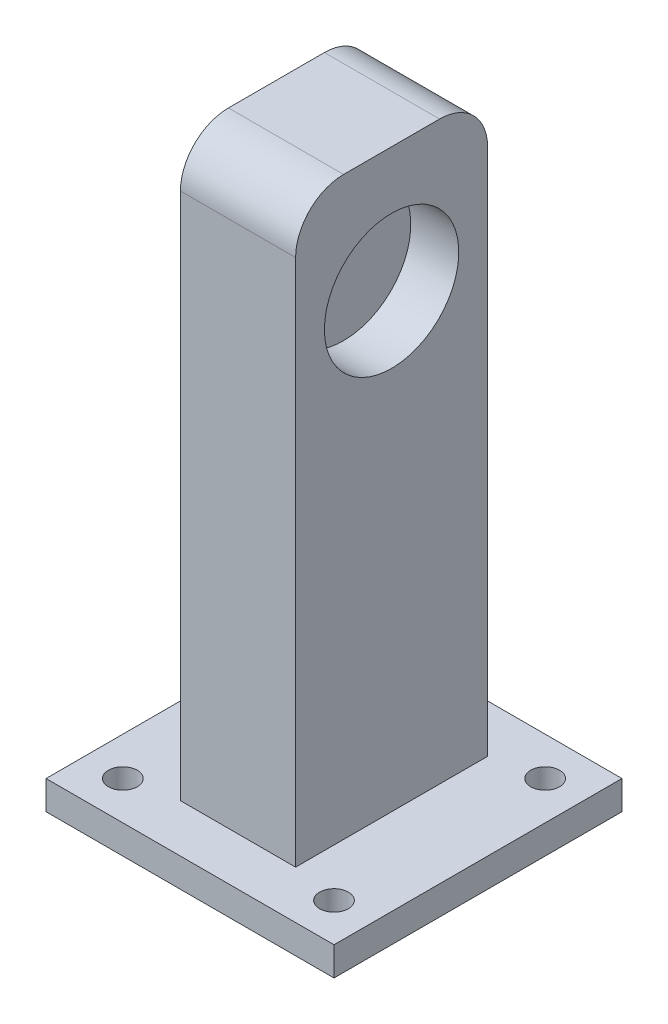
ISO-10303-21;
HEADER;
FILE_DESCRIPTION(('STEP AP214'),'2;1');
FILE_NAME('part.step','',(''),(''),'','','');
FILE_SCHEMA(('AUTOMOTIVE_DESIGN { 1 0 10303 214 1 1 1 1 }'));
ENDSEC;
DATA;
#1=APPLICATION_CONTEXT('core data for automotive mechanical design processes');
#2=APPLICATION_PROTOCOL_DEFINITION('international standard','automotive_design',2000,#1);
#3=PRODUCT_CONTEXT('',#1,'mechanical');
#4=PRODUCT('Part','Part','',(#3));
#5=PRODUCT_RELATED_PRODUCT_CATEGORY('part','',(#4));
#6=PRODUCT_DEFINITION_FORMATION('','',#4);
#7=PRODUCT_DEFINITION_CONTEXT('part definition',#1,'design');
#8=PRODUCT_DEFINITION('design','',#6,#7);
#9=PRODUCT_DEFINITION_SHAPE('','',#8);
#10=(LENGTH_UNIT() NAMED_UNIT(*) SI_UNIT(.MILLI.,.METRE.));
#11=(NAMED_UNIT(*) PLANE_ANGLE_UNIT() SI_UNIT($,.RADIAN.));
#12=(NAMED_UNIT(*) SI_UNIT($,.STERADIAN.) SOLID_ANGLE_UNIT());
#13=UNCERTAINTY_MEASURE_WITH_UNIT(LENGTH_MEASURE(1.E-05),#10,'distance_accuracy_value','');
#14=(GEOMETRIC_REPRESENTATION_CONTEXT(3) GLOBAL_UNCERTAINTY_ASSIGNED_CONTEXT((#13)) GLOBAL_UNIT_ASSIGNED_CONTEXT((#10,
#11,#12)) REPRESENTATION_CONTEXT('',''));
#15=CARTESIAN_POINT('',(0.,0.,0.));
#16=DIRECTION('',(0.,0.,1.));
#17=DIRECTION('',(1.,0.,0.));
#18=AXIS2_PLACEMENT_3D('',#15,#16,#17);
#19=CARTESIAN_POINT('',(30.,3.,30.));
#20=DIRECTION('',(0.,-1.,0.));
#21=DIRECTION('',(0.,0.,-1.));
#22=AXIS2_PLACEMENT_3D('',#19,#20,#21);
#23=PLANE('',#22);
#24=CARTESIAN_POINT('',(4.,3.,26.));
#25=DIRECTION('',(0.,1.,0.));
#26=DIRECTION('',(-1.,0.,0.));
#27=AXIS2_PLACEMENT_3D('',#24,#25,#26);
#28=CIRCLE('',#27,1.5);
#29=CARTESIAN_POINT('',(2.5,3.,26.));
#30=VERTEX_POINT('',#29);
#31=EDGE_CURVE('E228',#30,#30,#28,.T.);
#32=ORIENTED_EDGE('',*,*,#31,.F.);
#33=EDGE_LOOP('',(#32));
#34=FACE_BOUND('',#33,.T.);
#35=CARTESIAN_POINT('',(26.,2.99999999999999,26.));
#36=DIRECTION('',(0.,1.,0.));
#37=DIRECTION('',(-1.,0.,0.));
#38=AXIS2_PLACEMENT_3D('',#35,#36,#37);
#39=CIRCLE('',#38,1.5);
#40=CARTESIAN_POINT('',(24.5,2.99999999999999,26.));
#41=VERTEX_POINT('',#40);
#42=EDGE_CURVE('E234',#41,#41,#39,.T.);
#43=ORIENTED_EDGE('',*,*,#42,.F.);
#44=EDGE_LOOP('',(#43));
#45=FACE_BOUND('',#44,.T.);
#46=CARTESIAN_POINT('',(26.,2.99999999999999,4.));
#47=DIRECTION('',(0.,1.,0.));
#48=DIRECTION('',(-1.,0.,0.));
#49=AXIS2_PLACEMENT_3D('',#46,#47,#48);
#50=CIRCLE('',#49,1.5);
#51=CARTESIAN_POINT('',(24.5,2.99999999999999,4.));
#52=VERTEX_POINT('',#51);
#53=EDGE_CURVE('E222',#52,#52,#50,.T.);
#54=ORIENTED_EDGE('',*,*,#53,.F.);
#55=EDGE_LOOP('',(#54));
#56=FACE_BOUND('',#55,.T.);
#57=CARTESIAN_POINT('',(4.,3.,4.));
#58=DIRECTION('',(0.,1.,0.));
#59=DIRECTION('',(-1.,0.,0.));
#60=AXIS2_PLACEMENT_3D('',#57,#58,#59);
#61=CIRCLE('',#60,1.5);
#62=CARTESIAN_POINT('',(2.5,3.,4.));
#63=VERTEX_POINT('',#62);
#64=EDGE_CURVE('E219',#63,#63,#61,.T.);
#65=ORIENTED_EDGE('',*,*,#64,.F.);
#66=EDGE_LOOP('',(#65));
#67=FACE_BOUND('',#66,.T.);
#68=DIRECTION('',(-1.,0.,0.));
#69=VECTOR('',#68,1.);
#70=CARTESIAN_POINT('',(30.,3.,0.));
#71=LINE('',#70,#69);
#72=CARTESIAN_POINT('',(30.,3.,0.));
#73=VERTEX_POINT('',#72);
#74=CARTESIAN_POINT('',(0.,3.,0.));
#75=VERTEX_POINT('',#74);
#76=EDGE_CURVE('E146',#73,#75,#71,.T.);
#77=ORIENTED_EDGE('',*,*,#76,.T.);
#78=DIRECTION('',(0.,0.,-1.));
#79=VECTOR('',#78,1.);
#80=CARTESIAN_POINT('',(0.,3.,30.));
#81=LINE('',#80,#79);
#82=CARTESIAN_POINT('',(0.,3.,30.));
#83=VERTEX_POINT('',#82);
#84=EDGE_CURVE('E152',#83,#75,#81,.T.);
#85=ORIENTED_EDGE('',*,*,#84,.F.);
#86=DIRECTION('',(-1.,0.,0.));
#87=VECTOR('',#86,1.);
#88=CARTESIAN_POINT('',(30.,3.,30.));
#89=LINE('',#88,#87);
#90=CARTESIAN_POINT('',(30.,3.,30.));
#91=VERTEX_POINT('',#90);
#92=EDGE_CURVE('E150',#91,#83,#89,.T.);
#93=ORIENTED_EDGE('',*,*,#92,.F.);
#94=DIRECTION('',(0.,0.,-1.));
#95=VECTOR('',#94,1.);
#96=CARTESIAN_POINT('',(30.,3.,30.));
#97=LINE('',#96,#95);
#98=EDGE_CURVE('E162',#91,#73,#97,.T.);
#99=ORIENTED_EDGE('',*,*,#98,.T.);
#100=EDGE_LOOP('',(#77,#85,#93,#99));
#101=FACE_BOUND('',#100,.T.);
#102=DIRECTION('',(0.,0.,1.));
#103=VECTOR('',#102,1.);
#104=CARTESIAN_POINT('',(9.,3.,5.00000000000001));
#105=LINE('',#104,#103);
#106=CARTESIAN_POINT('',(9.,3.,5.00000000000001));
#107=VERTEX_POINT('',#106);
#108=CARTESIAN_POINT('',(9.,3.00000000000001,25.));
#109=VERTEX_POINT('',#108);
#110=EDGE_CURVE('E133',#107,#109,#105,.T.);
#111=ORIENTED_EDGE('',*,*,#110,.F.);
#112=DIRECTION('',(-1.,0.,0.));
#113=VECTOR('',#112,1.);
#114=CARTESIAN_POINT('',(21.,3.,5.00000000000001));
#115=LINE('',#114,#113);
#116=CARTESIAN_POINT('',(21.,3.,5.00000000000001));
#117=VERTEX_POINT('',#116);
#118=EDGE_CURVE('E120',#117,#107,#115,.T.);
#119=ORIENTED_EDGE('',*,*,#118,.F.);
#120=DIRECTION('',(0.,0.,1.));
#121=VECTOR('',#120,1.);
#122=CARTESIAN_POINT('',(21.,3.,5.00000000000001));
#123=LINE('',#122,#121);
#124=CARTESIAN_POINT('',(21.,3.00000000000001,25.));
#125=VERTEX_POINT('',#124);
#126=EDGE_CURVE('E122',#117,#125,#123,.T.);
#127=ORIENTED_EDGE('',*,*,#126,.T.);
#128=DIRECTION('',(-1.,0.,0.));
#129=VECTOR('',#128,1.);
#130=CARTESIAN_POINT('',(21.,3.00000000000001,25.));
#131=LINE('',#130,#129);
#132=EDGE_CURVE('E134',#125,#109,#131,.T.);
#133=ORIENTED_EDGE('',*,*,#132,.T.);
#134=EDGE_LOOP('',(#111,#119,#127,#133));
#135=FACE_BOUND('',#134,.T.);
#136=ADVANCED_FACE('F41',(#34,#45,#56,#67,#101,#135),#23,.F.);
#137=CARTESIAN_POINT('',(0.,3.,30.));
#138=DIRECTION('',(1.,0.,0.));
#139=DIRECTION('',(0.,0.,-1.));
#140=AXIS2_PLACEMENT_3D('',#137,#138,#139);
#141=PLANE('',#140);
#142=DIRECTION('',(0.,-1.,0.));
#143=VECTOR('',#142,1.);
#144=CARTESIAN_POINT('',(0.,3.,0.));
#145=LINE('',#144,#143);
#146=CARTESIAN_POINT('',(0.,0.,0.));
#147=VERTEX_POINT('',#146);
#148=EDGE_CURVE('E137',#75,#147,#145,.T.);
#149=ORIENTED_EDGE('',*,*,#148,.T.);
#150=DIRECTION('',(0.,0.,-1.));
#151=VECTOR('',#150,1.);
#152=CARTESIAN_POINT('',(0.,0.,30.));
#153=LINE('',#152,#151);
#154=CARTESIAN_POINT('',(0.,0.,30.));
#155=VERTEX_POINT('',#154);
#156=EDGE_CURVE('E168',#155,#147,#153,.T.);
#157=ORIENTED_EDGE('',*,*,#156,.F.);
#158=DIRECTION('',(0.,-1.,0.));
#159=VECTOR('',#158,1.);
#160=CARTESIAN_POINT('',(0.,3.,30.));
#161=LINE('',#160,#159);
#162=EDGE_CURVE('E142',#83,#155,#161,.T.);
#163=ORIENTED_EDGE('',*,*,#162,.F.);
#164=ORIENTED_EDGE('',*,*,#84,.T.);
#165=EDGE_LOOP('',(#149,#157,#163,#164));
#166=FACE_BOUND('',#165,.T.);
#167=ADVANCED_FACE('F247',(#166),#141,.F.);
#168=CARTESIAN_POINT('',(0.,0.,30.));
#169=DIRECTION('',(0.,1.,0.));
#170=DIRECTION('',(0.,0.,1.));
#171=AXIS2_PLACEMENT_3D('',#168,#169,#170);
#172=PLANE('',#171);
#173=CARTESIAN_POINT('',(4.,0.,26.));
#174=DIRECTION('',(0.,1.,0.));
#175=DIRECTION('',(-1.,0.,0.));
#176=AXIS2_PLACEMENT_3D('',#173,#174,#175);
#177=CIRCLE('',#176,1.5);
#178=CARTESIAN_POINT('',(2.5,0.,26.));
#179=VERTEX_POINT('',#178);
#180=EDGE_CURVE('E225',#179,#179,#177,.T.);
#181=ORIENTED_EDGE('',*,*,#180,.T.);
#182=EDGE_LOOP('',(#181));
#183=FACE_BOUND('',#182,.T.);
#184=CARTESIAN_POINT('',(26.,0.,26.));
#185=DIRECTION('',(0.,1.,0.));
#186=DIRECTION('',(-1.,0.,0.));
#187=AXIS2_PLACEMENT_3D('',#184,#185,#186);
#188=CIRCLE('',#187,1.5);
#189=CARTESIAN_POINT('',(24.5,0.,26.));
#190=VERTEX_POINT('',#189);
#191=EDGE_CURVE('E231',#190,#190,#188,.T.);
#192=ORIENTED_EDGE('',*,*,#191,.T.);
#193=EDGE_LOOP('',(#192));
#194=FACE_BOUND('',#193,.T.);
#195=CARTESIAN_POINT('',(26.,0.,4.));
#196=DIRECTION('',(0.,1.,0.));
#197=DIRECTION('',(-1.,0.,0.));
#198=AXIS2_PLACEMENT_3D('',#195,#196,#197);
#199=CIRCLE('',#198,1.5);
#200=CARTESIAN_POINT('',(24.5,0.,4.));
#201=VERTEX_POINT('',#200);
#202=EDGE_CURVE('E237',#201,#201,#199,.T.);
#203=ORIENTED_EDGE('',*,*,#202,.T.);
#204=EDGE_LOOP('',(#203));
#205=FACE_BOUND('',#204,.T.);
#206=CARTESIAN_POINT('',(4.,0.,4.));
#207=DIRECTION('',(0.,1.,0.));
#208=DIRECTION('',(-1.,0.,0.));
#209=AXIS2_PLACEMENT_3D('',#206,#207,#208);
#210=CIRCLE('',#209,1.5);
#211=CARTESIAN_POINT('',(2.5,0.,4.));
#212=VERTEX_POINT('',#211);
#213=EDGE_CURVE('E216',#212,#212,#210,.T.);
#214=ORIENTED_EDGE('',*,*,#213,.T.);
#215=EDGE_LOOP('',(#214));
#216=FACE_BOUND('',#215,.T.);
#217=DIRECTION('',(1.,0.,0.));
#218=VECTOR('',#217,1.);
#219=CARTESIAN_POINT('',(0.,0.,0.));
#220=LINE('',#219,#218);
#221=CARTESIAN_POINT('',(30.,0.,0.));
#222=VERTEX_POINT('',#221);
#223=EDGE_CURVE('E155',#147,#222,#220,.T.);
#224=ORIENTED_EDGE('',*,*,#223,.T.);
#225=DIRECTION('',(0.,0.,-1.));
#226=VECTOR('',#225,1.);
#227=CARTESIAN_POINT('',(30.,0.,30.));
#228=LINE('',#227,#226);
#229=CARTESIAN_POINT('',(30.,0.,30.));
#230=VERTEX_POINT('',#229);
#231=EDGE_CURVE('E165',#230,#222,#228,.T.);
#232=ORIENTED_EDGE('',*,*,#231,.F.);
#233=DIRECTION('',(1.,0.,0.));
#234=VECTOR('',#233,1.);
#235=CARTESIAN_POINT('',(0.,0.,30.));
#236=LINE('',#235,#234);
#237=EDGE_CURVE('E145',#155,#230,#236,.T.);
#238=ORIENTED_EDGE('',*,*,#237,.F.);
#239=ORIENTED_EDGE('',*,*,#156,.T.);
#240=EDGE_LOOP('',(#224,#232,#238,#239));
#241=FACE_BOUND('',#240,.T.);
#242=ADVANCED_FACE('F265',(#183,#194,#205,#216,#241),#172,.F.);
#243=CARTESIAN_POINT('',(30.,0.,30.));
#244=DIRECTION('',(-1.,0.,0.));
#245=DIRECTION('',(0.,0.,1.));
#246=AXIS2_PLACEMENT_3D('',#243,#244,#245);
#247=PLANE('',#246);
#248=DIRECTION('',(0.,1.,0.));
#249=VECTOR('',#248,1.);
#250=CARTESIAN_POINT('',(30.,0.,0.));
#251=LINE('',#250,#249);
#252=EDGE_CURVE('E157',#222,#73,#251,.T.);
#253=ORIENTED_EDGE('',*,*,#252,.T.);
#254=ORIENTED_EDGE('',*,*,#98,.F.);
#255=DIRECTION('',(0.,1.,0.));
#256=VECTOR('',#255,1.);
#257=CARTESIAN_POINT('',(30.,0.,30.));
#258=LINE('',#257,#256);
#259=EDGE_CURVE('E148',#230,#91,#258,.T.);
#260=ORIENTED_EDGE('',*,*,#259,.F.);
#261=ORIENTED_EDGE('',*,*,#231,.T.);
#262=EDGE_LOOP('',(#253,#254,#260,#261));
#263=FACE_BOUND('',#262,.T.);
#264=ADVANCED_FACE('F270',(#263),#247,.F.);
#265=CARTESIAN_POINT('',(0.,0.,30.));
#266=DIRECTION('',(0.,0.,1.));
#267=DIRECTION('',(1.,0.,0.));
#268=AXIS2_PLACEMENT_3D('',#265,#266,#267);
#269=PLANE('',#268);
#270=ORIENTED_EDGE('',*,*,#162,.T.);
#271=ORIENTED_EDGE('',*,*,#237,.T.);
#272=ORIENTED_EDGE('',*,*,#259,.T.);
#273=ORIENTED_EDGE('',*,*,#92,.T.);
#274=EDGE_LOOP('',(#270,#271,#272,#273));
#275=FACE_BOUND('',#274,.T.);
#276=ADVANCED_FACE('F268',(#275),#269,.T.);
#277=CARTESIAN_POINT('',(0.,0.,0.));
#278=DIRECTION('',(0.,0.,1.));
#279=DIRECTION('',(1.,0.,0.));
#280=AXIS2_PLACEMENT_3D('',#277,#278,#279);
#281=PLANE('',#280);
#282=ORIENTED_EDGE('',*,*,#148,.F.);
#283=ORIENTED_EDGE('',*,*,#76,.F.);
#284=ORIENTED_EDGE('',*,*,#252,.F.);
#285=ORIENTED_EDGE('',*,*,#223,.F.);
#286=EDGE_LOOP('',(#282,#283,#284,#285));
#287=FACE_BOUND('',#286,.T.);
#288=ADVANCED_FACE('F262',(#287),#281,.F.);
#289=CARTESIAN_POINT('',(21.,63.,5.));
#290=DIRECTION('',(0.,0.,-1.));
#291=DIRECTION('',(0.,1.,0.));
#292=AXIS2_PLACEMENT_3D('',#289,#290,#291);
#293=PLANE('',#292);
#294=DIRECTION('',(0.,-1.,0.));
#295=VECTOR('',#294,1.);
#296=CARTESIAN_POINT('',(9.,63.,5.));
#297=LINE('',#296,#295);
#298=CARTESIAN_POINT('',(9.,58.,5.));
#299=VERTEX_POINT('',#298);
#300=EDGE_CURVE('E204',#299,#107,#297,.T.);
#301=ORIENTED_EDGE('',*,*,#300,.F.);
#302=DIRECTION('',(-1.,0.,0.));
#303=VECTOR('',#302,1.);
#304=CARTESIAN_POINT('',(21.,58.,5.));
#305=LINE('',#304,#303);
#306=CARTESIAN_POINT('',(21.,58.,5.));
#307=VERTEX_POINT('',#306);
#308=EDGE_CURVE('E11',#299,#307,#305,.F.);
#309=ORIENTED_EDGE('',*,*,#308,.T.);
#310=DIRECTION('',(0.,-1.,0.));
#311=VECTOR('',#310,1.);
#312=CARTESIAN_POINT('',(21.,63.,5.));
#313=LINE('',#312,#311);
#314=EDGE_CURVE('E116',#307,#117,#313,.T.);
#315=ORIENTED_EDGE('',*,*,#314,.T.);
#316=ORIENTED_EDGE('',*,*,#118,.T.);
#317=EDGE_LOOP('',(#301,#309,#315,#316));
#318=FACE_BOUND('',#317,.T.);
#319=ADVANCED_FACE('F118',(#318),#293,.T.);
#320=CARTESIAN_POINT('',(21.,63.,25.));
#321=DIRECTION('',(0.,1.,0.));
#322=DIRECTION('',(0.,0.,1.));
#323=AXIS2_PLACEMENT_3D('',#320,#321,#322);
#324=PLANE('',#323);
#325=DIRECTION('',(0.,0.,-1.));
#326=VECTOR('',#325,1.);
#327=CARTESIAN_POINT('',(9.,63.,25.));
#328=LINE('',#327,#326);
#329=CARTESIAN_POINT('',(9.,63.,20.));
#330=VERTEX_POINT('',#329);
#331=CARTESIAN_POINT('',(9.,63.,10.));
#332=VERTEX_POINT('',#331);
#333=EDGE_CURVE('E123',#330,#332,#328,.T.);
#334=ORIENTED_EDGE('',*,*,#333,.F.);
#335=DIRECTION('',(-1.,0.,0.));
#336=VECTOR('',#335,1.);
#337=CARTESIAN_POINT('',(21.,63.,20.));
#338=LINE('',#337,#336);
#339=CARTESIAN_POINT('',(21.,63.,20.));
#340=VERTEX_POINT('',#339);
#341=EDGE_CURVE('E181',#330,#340,#338,.F.);
#342=ORIENTED_EDGE('',*,*,#341,.T.);
#343=DIRECTION('',(0.,0.,-1.));
#344=VECTOR('',#343,1.);
#345=CARTESIAN_POINT('',(21.,63.,25.));
#346=LINE('',#345,#344);
#347=CARTESIAN_POINT('',(21.,63.,10.));
#348=VERTEX_POINT('',#347);
#349=EDGE_CURVE('E135',#340,#348,#346,.T.);
#350=ORIENTED_EDGE('',*,*,#349,.T.);
#351=DIRECTION('',(-1.,0.,0.));
#352=VECTOR('',#351,1.);
#353=CARTESIAN_POINT('',(21.,63.,10.));
#354=LINE('',#353,#352);
#355=EDGE_CURVE('E178',#348,#332,#354,.T.);
#356=ORIENTED_EDGE('',*,*,#355,.T.);
#357=EDGE_LOOP('',(#334,#342,#350,#356));
#358=FACE_BOUND('',#357,.T.);
#359=ADVANCED_FACE('F199',(#358),#324,.T.);
#360=CARTESIAN_POINT('',(21.,3.00000000000001,25.));
#361=DIRECTION('',(0.,0.,1.));
#362=DIRECTION('',(1.,0.,0.));
#363=AXIS2_PLACEMENT_3D('',#360,#361,#362);
#364=PLANE('',#363);
#365=DIRECTION('',(0.,1.,0.));
#366=VECTOR('',#365,1.);
#367=CARTESIAN_POINT('',(21.,3.00000000000001,25.));
#368=LINE('',#367,#366);
#369=CARTESIAN_POINT('',(21.,58.,25.));
#370=VERTEX_POINT('',#369);
#371=EDGE_CURVE('E129',#125,#370,#368,.T.);
#372=ORIENTED_EDGE('',*,*,#371,.T.);
#373=DIRECTION('',(-1.,0.,0.));
#374=VECTOR('',#373,1.);
#375=CARTESIAN_POINT('',(21.,58.,25.));
#376=LINE('',#375,#374);
#377=CARTESIAN_POINT('',(9.,58.,25.));
#378=VERTEX_POINT('',#377);
#379=EDGE_CURVE('E171',#370,#378,#376,.T.);
#380=ORIENTED_EDGE('',*,*,#379,.T.);
#381=DIRECTION('',(0.,1.,0.));
#382=VECTOR('',#381,1.);
#383=CARTESIAN_POINT('',(9.,3.00000000000001,25.));
#384=LINE('',#383,#382);
#385=EDGE_CURVE('E197',#109,#378,#384,.T.);
#386=ORIENTED_EDGE('',*,*,#385,.F.);
#387=ORIENTED_EDGE('',*,*,#132,.F.);
#388=EDGE_LOOP('',(#372,#380,#386,#387));
#389=FACE_BOUND('',#388,.T.);
#390=ADVANCED_FACE('F188',(#389),#364,.T.);
#391=CARTESIAN_POINT('',(21.,0.,0.));
#392=DIRECTION('',(-1.,0.,0.));
#393=DIRECTION('',(0.,0.,1.));
#394=AXIS2_PLACEMENT_3D('',#391,#392,#393);
#395=PLANE('',#394);
#396=CARTESIAN_POINT('',(21.,50.,15.));
#397=DIRECTION('',(-1.,0.,0.));
#398=DIRECTION('',(0.,0.,1.));
#399=AXIS2_PLACEMENT_3D('',#396,#397,#398);
#400=CIRCLE('',#399,7.);
#401=CARTESIAN_POINT('',(21.,50.,22.));
#402=VERTEX_POINT('',#401);
#403=EDGE_CURVE('E210',#402,#402,#400,.T.);
#404=ORIENTED_EDGE('',*,*,#403,.T.);
#405=EDGE_LOOP('',(#404));
#406=FACE_BOUND('',#405,.T.);
#407=ORIENTED_EDGE('',*,*,#349,.F.);
#408=CARTESIAN_POINT('',(21.,58.,20.));
#409=DIRECTION('',(-1.,0.,0.));
#410=DIRECTION('',(0.,0.,1.));
#411=AXIS2_PLACEMENT_3D('',#408,#409,#410);
#412=CIRCLE('',#411,5.);
#413=EDGE_CURVE('E49',#340,#370,#412,.F.);
#414=ORIENTED_EDGE('',*,*,#413,.T.);
#415=ORIENTED_EDGE('',*,*,#371,.F.);
#416=ORIENTED_EDGE('',*,*,#126,.F.);
#417=ORIENTED_EDGE('',*,*,#314,.F.);
#418=CARTESIAN_POINT('',(21.,58.,10.));
#419=DIRECTION('',(-1.,0.,0.));
#420=DIRECTION('',(0.,0.,1.));
#421=AXIS2_PLACEMENT_3D('',#418,#419,#420);
#422=CIRCLE('',#421,5.);
#423=EDGE_CURVE('E61',#307,#348,#422,.F.);
#424=ORIENTED_EDGE('',*,*,#423,.T.);
#425=EDGE_LOOP('',(#407,#414,#415,#416,#417,#424));
#426=FACE_BOUND('',#425,.T.);
#427=ADVANCED_FACE('F127',(#406,#426),#395,.F.);
#428=CARTESIAN_POINT('',(9.,0.,0.));
#429=DIRECTION('',(-1.,0.,0.));
#430=DIRECTION('',(0.,0.,1.));
#431=AXIS2_PLACEMENT_3D('',#428,#429,#430);
#432=PLANE('',#431);
#433=CARTESIAN_POINT('',(9.,50.,15.));
#434=DIRECTION('',(-1.,0.,0.));
#435=DIRECTION('',(0.,0.,1.));
#436=AXIS2_PLACEMENT_3D('',#433,#434,#435);
#437=CIRCLE('',#436,7.);
#438=CARTESIAN_POINT('',(9.,50.,22.));
#439=VERTEX_POINT('',#438);
#440=EDGE_CURVE('E207',#439,#439,#437,.T.);
#441=ORIENTED_EDGE('',*,*,#440,.F.);
#442=EDGE_LOOP('',(#441));
#443=FACE_BOUND('',#442,.T.);
#444=ORIENTED_EDGE('',*,*,#385,.T.);
#445=CARTESIAN_POINT('',(9.,58.,20.));
#446=DIRECTION('',(-1.,0.,0.));
#447=DIRECTION('',(0.,0.,1.));
#448=AXIS2_PLACEMENT_3D('',#445,#446,#447);
#449=CIRCLE('',#448,5.);
#450=EDGE_CURVE('E176',#378,#330,#449,.T.);
#451=ORIENTED_EDGE('',*,*,#450,.T.);
#452=ORIENTED_EDGE('',*,*,#333,.T.);
#453=CARTESIAN_POINT('',(9.,58.,10.));
#454=DIRECTION('',(-1.,0.,0.));
#455=DIRECTION('',(0.,0.,1.));
#456=AXIS2_PLACEMENT_3D('',#453,#454,#455);
#457=CIRCLE('',#456,5.);
#458=EDGE_CURVE('E174',#332,#299,#457,.T.);
#459=ORIENTED_EDGE('',*,*,#458,.T.);
#460=ORIENTED_EDGE('',*,*,#300,.T.);
#461=ORIENTED_EDGE('',*,*,#110,.T.);
#462=EDGE_LOOP('',(#444,#451,#452,#459,#460,#461));
#463=FACE_BOUND('',#462,.T.);
#464=ADVANCED_FACE('F196',(#443,#463),#432,.T.);
#465=CARTESIAN_POINT('',(14.,50.,15.));
#466=DIRECTION('',(-1.,0.,0.));
#467=DIRECTION('',(0.,0.,1.));
#468=AXIS2_PLACEMENT_3D('',#465,#466,#467);
#469=CYLINDRICAL_SURFACE('',#468,7.);
#470=CARTESIAN_POINT('',(14.,50.,15.));
#471=DIRECTION('',(-1.,0.,0.));
#472=DIRECTION('',(0.,0.,1.));
#473=AXIS2_PLACEMENT_3D('',#470,#471,#472);
#474=CIRCLE('',#473,7.);
#475=CARTESIAN_POINT('',(14.,50.,22.));
#476=VERTEX_POINT('',#475);
#477=EDGE_CURVE('E205',#476,#476,#474,.T.);
#478=ORIENTED_EDGE('',*,*,#477,.F.);
#479=EDGE_LOOP('',(#478));
#480=FACE_BOUND('',#479,.T.);
#481=ORIENTED_EDGE('',*,*,#440,.T.);
#482=EDGE_LOOP('',(#481));
#483=FACE_BOUND('',#482,.T.);
#484=ADVANCED_FACE('F317',(#480,#483),#469,.F.);
#485=CARTESIAN_POINT('',(14.,50.,15.));
#486=DIRECTION('',(-1.,0.,0.));
#487=DIRECTION('',(0.,0.,1.));
#488=AXIS2_PLACEMENT_3D('',#485,#486,#487);
#489=PLANE('',#488);
#490=ORIENTED_EDGE('',*,*,#477,.T.);
#491=EDGE_LOOP('',(#490));
#492=FACE_BOUND('',#491,.T.);
#493=ADVANCED_FACE('F313',(#492),#489,.T.);
#494=CARTESIAN_POINT('',(21.,50.,15.));
#495=DIRECTION('',(-1.,0.,0.));
#496=DIRECTION('',(0.,0.,1.));
#497=AXIS2_PLACEMENT_3D('',#494,#495,#496);
#498=CYLINDRICAL_SURFACE('',#497,7.);
#499=ORIENTED_EDGE('',*,*,#403,.F.);
#500=EDGE_LOOP('',(#499));
#501=FACE_BOUND('',#500,.T.);
#502=CARTESIAN_POINT('',(16.,50.,15.));
#503=DIRECTION('',(-1.,0.,0.));
#504=DIRECTION('',(0.,0.,1.));
#505=AXIS2_PLACEMENT_3D('',#502,#503,#504);
#506=CIRCLE('',#505,7.);
#507=CARTESIAN_POINT('',(16.,50.,22.));
#508=VERTEX_POINT('',#507);
#509=EDGE_CURVE('E213',#508,#508,#506,.T.);
#510=ORIENTED_EDGE('',*,*,#509,.T.);
#511=EDGE_LOOP('',(#510));
#512=FACE_BOUND('',#511,.T.);
#513=ADVANCED_FACE('F309',(#501,#512),#498,.F.);
#514=CARTESIAN_POINT('',(16.,50.,15.));
#515=DIRECTION('',(-1.,0.,0.));
#516=DIRECTION('',(0.,0.,1.));
#517=AXIS2_PLACEMENT_3D('',#514,#515,#516);
#518=PLANE('',#517);
#519=ORIENTED_EDGE('',*,*,#509,.F.);
#520=EDGE_LOOP('',(#519));
#521=FACE_BOUND('',#520,.T.);
#522=ADVANCED_FACE('F305',(#521),#518,.F.);
#523=CARTESIAN_POINT('',(4.,0.,4.));
#524=DIRECTION('',(0.,1.,0.));
#525=DIRECTION('',(-1.,0.,0.));
#526=AXIS2_PLACEMENT_3D('',#523,#524,#525);
#527=CYLINDRICAL_SURFACE('',#526,1.5);
#528=CARTESIAN_POINT('',(2.5,0.,4.));
#529=CARTESIAN_POINT('',(2.5,0.0312499999999993,4.));
#530=CARTESIAN_POINT('',(2.5,0.0624999999999993,4.));
#531=CARTESIAN_POINT('',(2.5,0.124999999999999,4.));
#532=CARTESIAN_POINT('',(2.5,0.156249999999999,4.));
#533=CARTESIAN_POINT('',(2.5,0.21875,4.));
#534=CARTESIAN_POINT('',(2.5,0.25,4.));
#535=CARTESIAN_POINT('',(2.5,0.3125,4.));
#536=CARTESIAN_POINT('',(2.5,0.34375,4.));
#537=CARTESIAN_POINT('',(2.5,0.40625,4.));
#538=CARTESIAN_POINT('',(2.5,0.4375,4.));
#539=CARTESIAN_POINT('',(2.5,0.5,4.));
#540=CARTESIAN_POINT('',(2.5,0.53125,4.));
#541=CARTESIAN_POINT('',(2.5,0.59375,4.));
#542=CARTESIAN_POINT('',(2.5,0.625,4.));
#543=CARTESIAN_POINT('',(2.5,0.6875,4.));
#544=CARTESIAN_POINT('',(2.5,0.71875,4.));
#545=CARTESIAN_POINT('',(2.5,0.78125,4.));
#546=CARTESIAN_POINT('',(2.5,0.8125,4.));
#547=CARTESIAN_POINT('',(2.5,0.875,4.));
#548=CARTESIAN_POINT('',(2.5,0.90625,4.));
#549=CARTESIAN_POINT('',(2.5,0.968750000000001,4.));
#550=CARTESIAN_POINT('',(2.5,1.,4.));
#551=CARTESIAN_POINT('',(2.5,1.0625,4.));
#552=CARTESIAN_POINT('',(2.5,1.09375,4.));
#553=CARTESIAN_POINT('',(2.5,1.15625,4.));
#554=CARTESIAN_POINT('',(2.5,1.1875,4.));
#555=CARTESIAN_POINT('',(2.5,1.25,4.));
#556=CARTESIAN_POINT('',(2.5,1.28125,4.));
#557=CARTESIAN_POINT('',(2.5,1.34375,4.));
#558=CARTESIAN_POINT('',(2.5,1.375,4.));
#559=CARTESIAN_POINT('',(2.5,1.4375,4.));
#560=CARTESIAN_POINT('',(2.5,1.46875,4.));
#561=CARTESIAN_POINT('',(2.5,1.53125,4.));
#562=CARTESIAN_POINT('',(2.5,1.5625,4.));
#563=CARTESIAN_POINT('',(2.5,1.625,4.));
#564=CARTESIAN_POINT('',(2.5,1.65625,4.));
#565=CARTESIAN_POINT('',(2.5,1.71875,4.));
#566=CARTESIAN_POINT('',(2.5,1.75,4.));
#567=CARTESIAN_POINT('',(2.5,1.8125,4.));
#568=CARTESIAN_POINT('',(2.5,1.84375,4.));
#569=CARTESIAN_POINT('',(2.5,1.90625,4.));
#570=CARTESIAN_POINT('',(2.5,1.9375,4.));
#571=CARTESIAN_POINT('',(2.5,2.,4.));
#572=CARTESIAN_POINT('',(2.5,2.03125,4.));
#573=CARTESIAN_POINT('',(2.5,2.09375,4.));
#574=CARTESIAN_POINT('',(2.5,2.125,4.));
#575=CARTESIAN_POINT('',(2.5,2.1875,4.));
#576=CARTESIAN_POINT('',(2.5,2.21875,4.));
#577=CARTESIAN_POINT('',(2.5,2.28125,4.));
#578=CARTESIAN_POINT('',(2.5,2.3125,4.));
#579=CARTESIAN_POINT('',(2.5,2.375,4.));
#580=CARTESIAN_POINT('',(2.5,2.40625,4.));
#581=CARTESIAN_POINT('',(2.5,2.46875,4.));
#582=CARTESIAN_POINT('',(2.5,2.5,4.));
#583=CARTESIAN_POINT('',(2.5,2.5625,4.));
#584=CARTESIAN_POINT('',(2.5,2.59375,4.));
#585=CARTESIAN_POINT('',(2.5,2.65625,4.));
#586=CARTESIAN_POINT('',(2.5,2.6875,4.));
#587=CARTESIAN_POINT('',(2.5,2.75,4.));
#588=CARTESIAN_POINT('',(2.5,2.78125,4.));
#589=CARTESIAN_POINT('',(2.5,2.84375,4.));
#590=CARTESIAN_POINT('',(2.5,2.875,4.));
#591=CARTESIAN_POINT('',(2.5,2.9375,4.));
#592=CARTESIAN_POINT('',(2.5,2.96875,4.));
#593=CARTESIAN_POINT('',(2.5,3.,4.));
#594=B_SPLINE_CURVE_WITH_KNOTS('',3,(#528,#529,#530,#531,#532,#533,#534,#535,#536,#537,#538,
#539,#540,#541,#542,#543,#544,#545,#546,#547,#548,#549,#550,#551,#552,#553,#554,#555,#556,#557,
#558,#559,#560,#561,#562,#563,#564,#565,#566,#567,#568,#569,#570,#571,#572,#573,#574,#575,#576,
#577,#578,#579,#580,#581,#582,#583,#584,#585,#586,#587,#588,#589,#590,#591,#592,#593),
.UNSPECIFIED.,.F.,.F.,(4,2,2,2,2,2,2,2,2,2,2,2,2,2,2,2,2,2,2,2,2,2,2,2,2,2,2,2,2,2,2,2,4),(0.,
0.0937500000000001,0.1875,0.28125,0.375,0.468750000000001,0.562500000000001,0.656250000000001,
0.750000000000001,0.843750000000001,0.937500000000001,1.03125,1.125,1.21875,1.3125,1.40625,1.5,
1.59375,1.6875,1.78125,1.875,1.96875,2.0625,2.15625,2.25,2.34375,2.4375,2.53125,2.625,2.71875,
2.8125,2.90625,3.),.UNSPECIFIED.);
#595=EDGE_CURVE('BSEAM302',#212,#63,#594,.T.);
#596=ORIENTED_EDGE('',*,*,#213,.F.);
#597=ORIENTED_EDGE('',*,*,#64,.T.);
#598=ORIENTED_EDGE('',*,*,#595,.T.);
#599=ORIENTED_EDGE('',*,*,#595,.F.);
#600=EDGE_LOOP('',(#596,#598,#597,#599));
#601=FACE_BOUND('',#600,.T.);
#602=ADVANCED_FACE('F302',(#601),#527,.F.);
#603=CARTESIAN_POINT('',(26.,0.,4.));
#604=DIRECTION('',(0.,1.,0.));
#605=DIRECTION('',(-1.,0.,0.));
#606=AXIS2_PLACEMENT_3D('',#603,#604,#605);
#607=CYLINDRICAL_SURFACE('',#606,1.5);
#608=CARTESIAN_POINT('',(24.5,0.,4.));
#609=CARTESIAN_POINT('',(24.5,0.0312499999999906,4.));
#610=CARTESIAN_POINT('',(24.5,0.0624999999999907,4.));
#611=CARTESIAN_POINT('',(24.5,0.124999999999991,4.));
#612=CARTESIAN_POINT('',(24.5,0.156249999999991,4.));
#613=CARTESIAN_POINT('',(24.5,0.218749999999991,4.));
#614=CARTESIAN_POINT('',(24.5,0.249999999999991,4.));
#615=CARTESIAN_POINT('',(24.5,0.312499999999991,4.));
#616=CARTESIAN_POINT('',(24.5,0.343749999999991,4.));
#617=CARTESIAN_POINT('',(24.5,0.406249999999991,4.));
#618=CARTESIAN_POINT('',(24.5,0.437499999999991,4.));
#619=CARTESIAN_POINT('',(24.5,0.499999999999991,4.));
#620=CARTESIAN_POINT('',(24.5,0.531249999999991,4.));
#621=CARTESIAN_POINT('',(24.5,0.593749999999991,4.));
#622=CARTESIAN_POINT('',(24.5,0.624999999999991,4.));
#623=CARTESIAN_POINT('',(24.5,0.687499999999991,4.));
#624=CARTESIAN_POINT('',(24.5,0.718749999999992,4.));
#625=CARTESIAN_POINT('',(24.5,0.781249999999992,4.));
#626=CARTESIAN_POINT('',(24.5,0.812499999999992,4.));
#627=CARTESIAN_POINT('',(24.5,0.874999999999992,4.));
#628=CARTESIAN_POINT('',(24.5,0.906249999999992,4.));
#629=CARTESIAN_POINT('',(24.5,0.968749999999992,4.));
#630=CARTESIAN_POINT('',(24.5,0.999999999999992,4.));
#631=CARTESIAN_POINT('',(24.5,1.06249999999999,4.));
#632=CARTESIAN_POINT('',(24.5,1.09374999999999,4.));
#633=CARTESIAN_POINT('',(24.5,1.15624999999999,4.));
#634=CARTESIAN_POINT('',(24.5,1.18749999999999,4.));
#635=CARTESIAN_POINT('',(24.5,1.24999999999999,4.));
#636=CARTESIAN_POINT('',(24.5,1.28124999999999,4.));
#637=CARTESIAN_POINT('',(24.5,1.34374999999999,4.));
#638=CARTESIAN_POINT('',(24.5,1.37499999999999,4.));
#639=CARTESIAN_POINT('',(24.5,1.43749999999999,4.));
#640=CARTESIAN_POINT('',(24.5,1.46874999999999,4.));
#641=CARTESIAN_POINT('',(24.5,1.53124999999999,4.));
#642=CARTESIAN_POINT('',(24.5,1.56249999999999,4.));
#643=CARTESIAN_POINT('',(24.5,1.62499999999999,4.));
#644=CARTESIAN_POINT('',(24.5,1.65624999999999,4.));
#645=CARTESIAN_POINT('',(24.5,1.71874999999999,4.));
#646=CARTESIAN_POINT('',(24.5,1.74999999999999,4.));
#647=CARTESIAN_POINT('',(24.5,1.81249999999999,4.));
#648=CARTESIAN_POINT('',(24.5,1.84374999999999,4.));
#649=CARTESIAN_POINT('',(24.5,1.90624999999999,4.));
#650=CARTESIAN_POINT('',(24.5,1.93749999999999,4.));
#651=CARTESIAN_POINT('',(24.5,1.99999999999999,4.));
#652=CARTESIAN_POINT('',(24.5,2.03124999999999,4.));
#653=CARTESIAN_POINT('',(24.5,2.09374999999999,4.));
#654=CARTESIAN_POINT('',(24.5,2.12499999999999,4.));
#655=CARTESIAN_POINT('',(24.5,2.18749999999999,4.));
#656=CARTESIAN_POINT('',(24.5,2.21874999999999,4.));
#657=CARTESIAN_POINT('',(24.5,2.28124999999999,4.));
#658=CARTESIAN_POINT('',(24.5,2.31249999999999,4.));
#659=CARTESIAN_POINT('',(24.5,2.37499999999999,4.));
#660=CARTESIAN_POINT('',(24.5,2.40624999999999,4.));
#661=CARTESIAN_POINT('',(24.5,2.46874999999999,4.));
#662=CARTESIAN_POINT('',(24.5,2.49999999999999,4.));
#663=CARTESIAN_POINT('',(24.5,2.56249999999999,4.));
#664=CARTESIAN_POINT('',(24.5,2.59374999999999,4.));
#665=CARTESIAN_POINT('',(24.5,2.65624999999999,4.));
#666=CARTESIAN_POINT('',(24.5,2.68749999999999,4.));
#667=CARTESIAN_POINT('',(24.5,2.74999999999999,4.));
#668=CARTESIAN_POINT('',(24.5,2.78124999999999,4.));
#669=CARTESIAN_POINT('',(24.5,2.84374999999999,4.));
#670=CARTESIAN_POINT('',(24.5,2.87499999999999,4.));
#671=CARTESIAN_POINT('',(24.5,2.93749999999999,4.));
#672=CARTESIAN_POINT('',(24.5,2.96874999999999,4.));
#673=CARTESIAN_POINT('',(24.5,2.99999999999999,4.));
#674=B_SPLINE_CURVE_WITH_KNOTS('',3,(#608,#609,#610,#611,#612,#613,#614,#615,#616,#617,#618,
#619,#620,#621,#622,#623,#624,#625,#626,#627,#628,#629,#630,#631,#632,#633,#634,#635,#636,#637,
#638,#639,#640,#641,#642,#643,#644,#645,#646,#647,#648,#649,#650,#651,#652,#653,#654,#655,#656,
#657,#658,#659,#660,#661,#662,#663,#664,#665,#666,#667,#668,#669,#670,#671,#672,#673),
.UNSPECIFIED.,.F.,.F.,(4,2,2,2,2,2,2,2,2,2,2,2,2,2,2,2,2,2,2,2,2,2,2,2,2,2,2,2,2,2,2,2,4),(0.,
0.0937500000000001,0.1875,0.28125,0.375,0.468750000000001,0.562500000000001,0.656250000000001,
0.750000000000001,0.843750000000001,0.937500000000001,1.03125,1.125,1.21875,1.3125,1.40625,1.5,
1.59375,1.6875,1.78125,1.875,1.96875,2.0625,2.15625,2.25,2.34375,2.4375,2.53125,2.625,2.71875,
2.8125,2.90625,3.),.UNSPECIFIED.);
#675=EDGE_CURVE('BSEAM243',#201,#52,#674,.T.);
#676=ORIENTED_EDGE('',*,*,#202,.F.);
#677=ORIENTED_EDGE('',*,*,#53,.T.);
#678=ORIENTED_EDGE('',*,*,#675,.T.);
#679=ORIENTED_EDGE('',*,*,#675,.F.);
#680=EDGE_LOOP('',(#676,#678,#677,#679));
#681=FACE_BOUND('',#680,.T.);
#682=ADVANCED_FACE('F243',(#681),#607,.F.);
#683=CARTESIAN_POINT('',(26.,0.,26.));
#684=DIRECTION('',(0.,1.,0.));
#685=DIRECTION('',(-1.,0.,0.));
#686=AXIS2_PLACEMENT_3D('',#683,#684,#685);
#687=CYLINDRICAL_SURFACE('',#686,1.5);
#688=CARTESIAN_POINT('',(24.5,0.,26.));
#689=CARTESIAN_POINT('',(24.5,0.0312499999999906,26.));
#690=CARTESIAN_POINT('',(24.5,0.0624999999999907,26.));
#691=CARTESIAN_POINT('',(24.5,0.124999999999991,26.));
#692=CARTESIAN_POINT('',(24.5,0.156249999999991,26.));
#693=CARTESIAN_POINT('',(24.5,0.218749999999991,26.));
#694=CARTESIAN_POINT('',(24.5,0.249999999999991,26.));
#695=CARTESIAN_POINT('',(24.5,0.312499999999991,26.));
#696=CARTESIAN_POINT('',(24.5,0.343749999999991,26.));
#697=CARTESIAN_POINT('',(24.5,0.406249999999991,26.));
#698=CARTESIAN_POINT('',(24.5,0.437499999999991,26.));
#699=CARTESIAN_POINT('',(24.5,0.499999999999991,26.));
#700=CARTESIAN_POINT('',(24.5,0.531249999999991,26.));
#701=CARTESIAN_POINT('',(24.5,0.593749999999991,26.));
#702=CARTESIAN_POINT('',(24.5,0.624999999999991,26.));
#703=CARTESIAN_POINT('',(24.5,0.687499999999991,26.));
#704=CARTESIAN_POINT('',(24.5,0.718749999999992,26.));
#705=CARTESIAN_POINT('',(24.5,0.781249999999992,26.));
#706=CARTESIAN_POINT('',(24.5,0.812499999999992,26.));
#707=CARTESIAN_POINT('',(24.5,0.874999999999992,26.));
#708=CARTESIAN_POINT('',(24.5,0.906249999999992,26.));
#709=CARTESIAN_POINT('',(24.5,0.968749999999992,26.));
#710=CARTESIAN_POINT('',(24.5,0.999999999999992,26.));
#711=CARTESIAN_POINT('',(24.5,1.06249999999999,26.));
#712=CARTESIAN_POINT('',(24.5,1.09374999999999,26.));
#713=CARTESIAN_POINT('',(24.5,1.15624999999999,26.));
#714=CARTESIAN_POINT('',(24.5,1.18749999999999,26.));
#715=CARTESIAN_POINT('',(24.5,1.24999999999999,26.));
#716=CARTESIAN_POINT('',(24.5,1.28124999999999,26.));
#717=CARTESIAN_POINT('',(24.5,1.34374999999999,26.));
#718=CARTESIAN_POINT('',(24.5,1.37499999999999,26.));
#719=CARTESIAN_POINT('',(24.5,1.43749999999999,26.));
#720=CARTESIAN_POINT('',(24.5,1.46874999999999,26.));
#721=CARTESIAN_POINT('',(24.5,1.53124999999999,26.));
#722=CARTESIAN_POINT('',(24.5,1.56249999999999,26.));
#723=CARTESIAN_POINT('',(24.5,1.62499999999999,26.));
#724=CARTESIAN_POINT('',(24.5,1.65624999999999,26.));
#725=CARTESIAN_POINT('',(24.5,1.71874999999999,26.));
#726=CARTESIAN_POINT('',(24.5,1.74999999999999,26.));
#727=CARTESIAN_POINT('',(24.5,1.81249999999999,26.));
#728=CARTESIAN_POINT('',(24.5,1.84374999999999,26.));
#729=CARTESIAN_POINT('',(24.5,1.90624999999999,26.));
#730=CARTESIAN_POINT('',(24.5,1.93749999999999,26.));
#731=CARTESIAN_POINT('',(24.5,1.99999999999999,26.));
#732=CARTESIAN_POINT('',(24.5,2.03124999999999,26.));
#733=CARTESIAN_POINT('',(24.5,2.09374999999999,26.));
#734=CARTESIAN_POINT('',(24.5,2.12499999999999,26.));
#735=CARTESIAN_POINT('',(24.5,2.18749999999999,26.));
#736=CARTESIAN_POINT('',(24.5,2.21874999999999,26.));
#737=CARTESIAN_POINT('',(24.5,2.28124999999999,26.));
#738=CARTESIAN_POINT('',(24.5,2.31249999999999,26.));
#739=CARTESIAN_POINT('',(24.5,2.37499999999999,26.));
#740=CARTESIAN_POINT('',(24.5,2.40624999999999,26.));
#741=CARTESIAN_POINT('',(24.5,2.46874999999999,26.));
#742=CARTESIAN_POINT('',(24.5,2.49999999999999,26.));
#743=CARTESIAN_POINT('',(24.5,2.56249999999999,26.));
#744=CARTESIAN_POINT('',(24.5,2.59374999999999,26.));
#745=CARTESIAN_POINT('',(24.5,2.65624999999999,26.));
#746=CARTESIAN_POINT('',(24.5,2.68749999999999,26.));
#747=CARTESIAN_POINT('',(24.5,2.74999999999999,26.));
#748=CARTESIAN_POINT('',(24.5,2.78124999999999,26.));
#749=CARTESIAN_POINT('',(24.5,2.84374999999999,26.));
#750=CARTESIAN_POINT('',(24.5,2.87499999999999,26.));
#751=CARTESIAN_POINT('',(24.5,2.93749999999999,26.));
#752=CARTESIAN_POINT('',(24.5,2.96874999999999,26.));
#753=CARTESIAN_POINT('',(24.5,2.99999999999999,26.));
#754=B_SPLINE_CURVE_WITH_KNOTS('',3,(#688,#689,#690,#691,#692,#693,#694,#695,#696,#697,#698,
#699,#700,#701,#702,#703,#704,#705,#706,#707,#708,#709,#710,#711,#712,#713,#714,#715,#716,#717,
#718,#719,#720,#721,#722,#723,#724,#725,#726,#727,#728,#729,#730,#731,#732,#733,#734,#735,#736,
#737,#738,#739,#740,#741,#742,#743,#744,#745,#746,#747,#748,#749,#750,#751,#752,#753),
.UNSPECIFIED.,.F.,.F.,(4,2,2,2,2,2,2,2,2,2,2,2,2,2,2,2,2,2,2,2,2,2,2,2,2,2,2,2,2,2,2,2,4),(0.,
0.0937500000000001,0.1875,0.28125,0.375,0.468750000000001,0.562500000000001,0.656250000000001,
0.750000000000001,0.843750000000001,0.937500000000001,1.03125,1.125,1.21875,1.3125,1.40625,1.5,
1.59375,1.6875,1.78125,1.875,1.96875,2.0625,2.15625,2.25,2.34375,2.4375,2.53125,2.625,2.71875,
2.8125,2.90625,3.),.UNSPECIFIED.);
#755=EDGE_CURVE('BSEAM290',#190,#41,#754,.T.);
#756=ORIENTED_EDGE('',*,*,#191,.F.);
#757=ORIENTED_EDGE('',*,*,#42,.T.);
#758=ORIENTED_EDGE('',*,*,#755,.T.);
#759=ORIENTED_EDGE('',*,*,#755,.F.);
#760=EDGE_LOOP('',(#756,#758,#757,#759));
#761=FACE_BOUND('',#760,.T.);
#762=ADVANCED_FACE('F290',(#761),#687,.F.);
#763=CARTESIAN_POINT('',(4.,0.,26.));
#764=DIRECTION('',(0.,1.,0.));
#765=DIRECTION('',(-1.,0.,0.));
#766=AXIS2_PLACEMENT_3D('',#763,#764,#765);
#767=CYLINDRICAL_SURFACE('',#766,1.5);
#768=CARTESIAN_POINT('',(2.5,0.,26.));
#769=CARTESIAN_POINT('',(2.5,0.0312499999999993,26.));
#770=CARTESIAN_POINT('',(2.5,0.0624999999999993,26.));
#771=CARTESIAN_POINT('',(2.5,0.124999999999999,26.));
#772=CARTESIAN_POINT('',(2.5,0.156249999999999,26.));
#773=CARTESIAN_POINT('',(2.5,0.21875,26.));
#774=CARTESIAN_POINT('',(2.5,0.25,26.));
#775=CARTESIAN_POINT('',(2.5,0.3125,26.));
#776=CARTESIAN_POINT('',(2.5,0.34375,26.));
#777=CARTESIAN_POINT('',(2.5,0.40625,26.));
#778=CARTESIAN_POINT('',(2.5,0.4375,26.));
#779=CARTESIAN_POINT('',(2.5,0.5,26.));
#780=CARTESIAN_POINT('',(2.5,0.53125,26.));
#781=CARTESIAN_POINT('',(2.5,0.59375,26.));
#782=CARTESIAN_POINT('',(2.5,0.625,26.));
#783=CARTESIAN_POINT('',(2.5,0.6875,26.));
#784=CARTESIAN_POINT('',(2.5,0.71875,26.));
#785=CARTESIAN_POINT('',(2.5,0.78125,26.));
#786=CARTESIAN_POINT('',(2.5,0.8125,26.));
#787=CARTESIAN_POINT('',(2.5,0.875,26.));
#788=CARTESIAN_POINT('',(2.5,0.90625,26.));
#789=CARTESIAN_POINT('',(2.5,0.968750000000001,26.));
#790=CARTESIAN_POINT('',(2.5,1.,26.));
#791=CARTESIAN_POINT('',(2.5,1.0625,26.));
#792=CARTESIAN_POINT('',(2.5,1.09375,26.));
#793=CARTESIAN_POINT('',(2.5,1.15625,26.));
#794=CARTESIAN_POINT('',(2.5,1.1875,26.));
#795=CARTESIAN_POINT('',(2.5,1.25,26.));
#796=CARTESIAN_POINT('',(2.5,1.28125,26.));
#797=CARTESIAN_POINT('',(2.5,1.34375,26.));
#798=CARTESIAN_POINT('',(2.5,1.375,26.));
#799=CARTESIAN_POINT('',(2.5,1.4375,26.));
#800=CARTESIAN_POINT('',(2.5,1.46875,26.));
#801=CARTESIAN_POINT('',(2.5,1.53125,26.));
#802=CARTESIAN_POINT('',(2.5,1.5625,26.));
#803=CARTESIAN_POINT('',(2.5,1.625,26.));
#804=CARTESIAN_POINT('',(2.5,1.65625,26.));
#805=CARTESIAN_POINT('',(2.5,1.71875,26.));
#806=CARTESIAN_POINT('',(2.5,1.75,26.));
#807=CARTESIAN_POINT('',(2.5,1.8125,26.));
#808=CARTESIAN_POINT('',(2.5,1.84375,26.));
#809=CARTESIAN_POINT('',(2.5,1.90625,26.));
#810=CARTESIAN_POINT('',(2.5,1.9375,26.));
#811=CARTESIAN_POINT('',(2.5,2.,26.));
#812=CARTESIAN_POINT('',(2.5,2.03125,26.));
#813=CARTESIAN_POINT('',(2.5,2.09375,26.));
#814=CARTESIAN_POINT('',(2.5,2.125,26.));
#815=CARTESIAN_POINT('',(2.5,2.1875,26.));
#816=CARTESIAN_POINT('',(2.5,2.21875,26.));
#817=CARTESIAN_POINT('',(2.5,2.28125,26.));
#818=CARTESIAN_POINT('',(2.5,2.3125,26.));
#819=CARTESIAN_POINT('',(2.5,2.375,26.));
#820=CARTESIAN_POINT('',(2.5,2.40625,26.));
#821=CARTESIAN_POINT('',(2.5,2.46875,26.));
#822=CARTESIAN_POINT('',(2.5,2.5,26.));
#823=CARTESIAN_POINT('',(2.5,2.5625,26.));
#824=CARTESIAN_POINT('',(2.5,2.59375,26.));
#825=CARTESIAN_POINT('',(2.5,2.65625,26.));
#826=CARTESIAN_POINT('',(2.5,2.6875,26.));
#827=CARTESIAN_POINT('',(2.5,2.75,26.));
#828=CARTESIAN_POINT('',(2.5,2.78125,26.));
#829=CARTESIAN_POINT('',(2.5,2.84375,26.));
#830=CARTESIAN_POINT('',(2.5,2.875,26.));
#831=CARTESIAN_POINT('',(2.5,2.9375,26.));
#832=CARTESIAN_POINT('',(2.5,2.96875,26.));
#833=CARTESIAN_POINT('',(2.5,3.,26.));
#834=B_SPLINE_CURVE_WITH_KNOTS('',3,(#768,#769,#770,#771,#772,#773,#774,#775,#776,#777,#778,
#779,#780,#781,#782,#783,#784,#785,#786,#787,#788,#789,#790,#791,#792,#793,#794,#795,#796,#797,
#798,#799,#800,#801,#802,#803,#804,#805,#806,#807,#808,#809,#810,#811,#812,#813,#814,#815,#816,
#817,#818,#819,#820,#821,#822,#823,#824,#825,#826,#827,#828,#829,#830,#831,#832,#833),
.UNSPECIFIED.,.F.,.F.,(4,2,2,2,2,2,2,2,2,2,2,2,2,2,2,2,2,2,2,2,2,2,2,2,2,2,2,2,2,2,2,2,4),(0.,
0.0937500000000001,0.1875,0.28125,0.375,0.468750000000001,0.562500000000001,0.656250000000001,
0.750000000000001,0.843750000000001,0.937500000000001,1.03125,1.125,1.21875,1.3125,1.40625,1.5,
1.59375,1.6875,1.78125,1.875,1.96875,2.0625,2.15625,2.25,2.34375,2.4375,2.53125,2.625,2.71875,
2.8125,2.90625,3.),.UNSPECIFIED.);
#835=EDGE_CURVE('BSEAM284',#179,#30,#834,.T.);
#836=ORIENTED_EDGE('',*,*,#180,.F.);
#837=ORIENTED_EDGE('',*,*,#31,.T.);
#838=ORIENTED_EDGE('',*,*,#835,.T.);
#839=ORIENTED_EDGE('',*,*,#835,.F.);
#840=EDGE_LOOP('',(#836,#838,#837,#839));
#841=FACE_BOUND('',#840,.T.);
#842=ADVANCED_FACE('F284',(#841),#767,.F.);
#843=CARTESIAN_POINT('',(21.,58.,20.));
#844=DIRECTION('',(-1.,0.,0.));
#845=DIRECTION('',(0.,0.,1.));
#846=AXIS2_PLACEMENT_3D('',#843,#844,#845);
#847=CYLINDRICAL_SURFACE('',#846,5.);
#848=ORIENTED_EDGE('',*,*,#413,.F.);
#849=ORIENTED_EDGE('',*,*,#341,.F.);
#850=ORIENTED_EDGE('',*,*,#450,.F.);
#851=ORIENTED_EDGE('',*,*,#379,.F.);
#852=EDGE_LOOP('',(#848,#849,#850,#851));
#853=FACE_BOUND('',#852,.T.);
#854=ADVANCED_FACE('F192',(#853),#847,.T.);
#855=CARTESIAN_POINT('',(21.,58.,10.));
#856=DIRECTION('',(-1.,0.,0.));
#857=DIRECTION('',(0.,0.,1.));
#858=AXIS2_PLACEMENT_3D('',#855,#856,#857);
#859=CYLINDRICAL_SURFACE('',#858,5.);
#860=ORIENTED_EDGE('',*,*,#423,.F.);
#861=ORIENTED_EDGE('',*,*,#308,.F.);
#862=ORIENTED_EDGE('',*,*,#458,.F.);
#863=ORIENTED_EDGE('',*,*,#355,.F.);
#864=EDGE_LOOP('',(#860,#861,#862,#863));
#865=FACE_BOUND('',#864,.T.);
#866=ADVANCED_FACE('F43',(#865),#859,.T.);
#867=CLOSED_SHELL('',(#136,#167,#242,#264,#276,#288,#319,#359,#390,#427,#464,#484,#493,#513,
#522,#602,#682,#762,#842,#854,#866));
#868=MANIFOLD_SOLID_BREP('B2',#867);
#869=ADVANCED_BREP_SHAPE_REPRESENTATION('',(#18,#868),#14);
#870=SHAPE_DEFINITION_REPRESENTATION(#9,#869);
ENDSEC;
END-ISO-10303-21;
